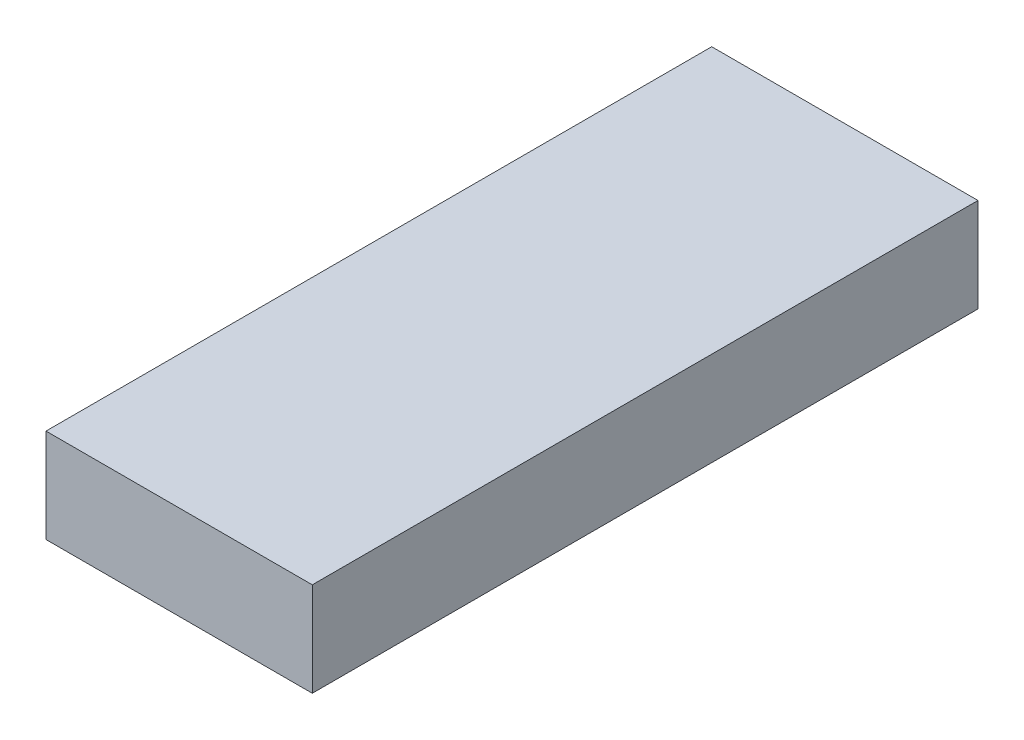
ISO-10303-21;
HEADER;
FILE_DESCRIPTION(('STEP AP214'),'2;1');
FILE_NAME('part.step','',(''),(''),'','','');
FILE_SCHEMA(('AUTOMOTIVE_DESIGN { 1 0 10303 214 1 1 1 1 }'));
ENDSEC;
DATA;
#1=APPLICATION_CONTEXT('core data for automotive mechanical design processes');
#2=APPLICATION_PROTOCOL_DEFINITION('international standard','automotive_design',2000,#1);
#3=PRODUCT_CONTEXT('',#1,'mechanical');
#4=PRODUCT('Part','Part','',(#3));
#5=PRODUCT_RELATED_PRODUCT_CATEGORY('part','',(#4));
#6=PRODUCT_DEFINITION_FORMATION('','',#4);
#7=PRODUCT_DEFINITION_CONTEXT('part definition',#1,'design');
#8=PRODUCT_DEFINITION('design','',#6,#7);
#9=PRODUCT_DEFINITION_SHAPE('','',#8);
#10=(LENGTH_UNIT() NAMED_UNIT(*) SI_UNIT(.MILLI.,.METRE.));
#11=(NAMED_UNIT(*) PLANE_ANGLE_UNIT() SI_UNIT($,.RADIAN.));
#12=(NAMED_UNIT(*) SI_UNIT($,.STERADIAN.) SOLID_ANGLE_UNIT());
#13=UNCERTAINTY_MEASURE_WITH_UNIT(LENGTH_MEASURE(1.E-05),#10,'distance_accuracy_value','');
#14=(GEOMETRIC_REPRESENTATION_CONTEXT(3) GLOBAL_UNCERTAINTY_ASSIGNED_CONTEXT((#13)) GLOBAL_UNIT_ASSIGNED_CONTEXT((#10,
#11,#12)) REPRESENTATION_CONTEXT('',''));
#15=CARTESIAN_POINT('',(0.,0.,0.));
#16=DIRECTION('',(0.,0.,1.));
#17=DIRECTION('',(1.,0.,0.));
#18=AXIS2_PLACEMENT_3D('',#15,#16,#17);
#19=CARTESIAN_POINT('',(-9.000000034,6.35,-22.499999958));
#20=DIRECTION('',(1.,0.,0.));
#21=DIRECTION('',(0.,0.,-1.));
#22=AXIS2_PLACEMENT_3D('',#19,#20,#21);
#23=PLANE('',#22);
#24=DIRECTION('',(0.,0.,1.));
#25=VECTOR('',#24,1.);
#26=CARTESIAN_POINT('',(-9.000000034,0.,-22.499999958));
#27=LINE('',#26,#25);
#28=CARTESIAN_POINT('',(-9.000000034,0.,-22.499999958));
#29=VERTEX_POINT('',#28);
#30=CARTESIAN_POINT('',(-9.000000034,0.,22.499999958));
#31=VERTEX_POINT('',#30);
#32=EDGE_CURVE('E98',#29,#31,#27,.T.);
#33=ORIENTED_EDGE('',*,*,#32,.T.);
#34=DIRECTION('',(0.,-1.,0.));
#35=VECTOR('',#34,1.);
#36=CARTESIAN_POINT('',(-9.000000034,6.35,22.499999958));
#37=LINE('',#36,#35);
#38=CARTESIAN_POINT('',(-9.000000034,6.35,22.499999958));
#39=VERTEX_POINT('',#38);
#40=EDGE_CURVE('E11',#39,#31,#37,.T.);
#41=ORIENTED_EDGE('',*,*,#40,.F.);
#42=DIRECTION('',(0.,0.,1.));
#43=VECTOR('',#42,1.);
#44=CARTESIAN_POINT('',(-9.000000034,6.35,-22.499999958));
#45=LINE('',#44,#43);
#46=CARTESIAN_POINT('',(-9.000000034,6.35,-22.499999958));
#47=VERTEX_POINT('',#46);
#48=EDGE_CURVE('E86',#47,#39,#45,.T.);
#49=ORIENTED_EDGE('',*,*,#48,.F.);
#50=DIRECTION('',(0.,-1.,0.));
#51=VECTOR('',#50,1.);
#52=CARTESIAN_POINT('',(-9.000000034,6.35,-22.499999958));
#53=LINE('',#52,#51);
#54=EDGE_CURVE('E94',#47,#29,#53,.T.);
#55=ORIENTED_EDGE('',*,*,#54,.T.);
#56=EDGE_LOOP('',(#33,#41,#49,#55));
#57=FACE_BOUND('',#56,.T.);
#58=ADVANCED_FACE('F35',(#57),#23,.F.);
#59=CARTESIAN_POINT('',(9.00000003400001,6.35,22.499999958));
#60=DIRECTION('',(0.,0.,-1.));
#61=DIRECTION('',(-1.,0.,0.));
#62=AXIS2_PLACEMENT_3D('',#59,#60,#61);
#63=PLANE('',#62);
#64=DIRECTION('',(1.,0.,0.));
#65=VECTOR('',#64,1.);
#66=CARTESIAN_POINT('',(9.00000003400001,0.,22.499999958));
#67=LINE('',#66,#65);
#68=CARTESIAN_POINT('',(9.00000003400001,0.,22.499999958));
#69=VERTEX_POINT('',#68);
#70=EDGE_CURVE('E90',#31,#69,#67,.T.);
#71=ORIENTED_EDGE('',*,*,#70,.T.);
#72=DIRECTION('',(0.,-1.,0.));
#73=VECTOR('',#72,1.);
#74=CARTESIAN_POINT('',(9.00000003400001,6.35,22.499999958));
#75=LINE('',#74,#73);
#76=CARTESIAN_POINT('',(9.00000003400001,6.35,22.499999958));
#77=VERTEX_POINT('',#76);
#78=EDGE_CURVE('E43',#77,#69,#75,.T.);
#79=ORIENTED_EDGE('',*,*,#78,.F.);
#80=DIRECTION('',(1.,0.,0.));
#81=VECTOR('',#80,1.);
#82=CARTESIAN_POINT('',(9.00000003400001,6.35,22.499999958));
#83=LINE('',#82,#81);
#84=EDGE_CURVE('E81',#39,#77,#83,.T.);
#85=ORIENTED_EDGE('',*,*,#84,.F.);
#86=ORIENTED_EDGE('',*,*,#40,.T.);
#87=EDGE_LOOP('',(#71,#79,#85,#86));
#88=FACE_BOUND('',#87,.T.);
#89=ADVANCED_FACE('F89',(#88),#63,.F.);
#90=CARTESIAN_POINT('',(9.000000034,6.35,-22.499999958));
#91=DIRECTION('',(-1.,0.,0.));
#92=DIRECTION('',(0.,0.,1.));
#93=AXIS2_PLACEMENT_3D('',#90,#91,#92);
#94=PLANE('',#93);
#95=DIRECTION('',(0.,0.,-1.));
#96=VECTOR('',#95,1.);
#97=CARTESIAN_POINT('',(9.000000034,0.,-22.499999958));
#98=LINE('',#97,#96);
#99=CARTESIAN_POINT('',(9.000000034,0.,-22.499999958));
#100=VERTEX_POINT('',#99);
#101=EDGE_CURVE('E68',#69,#100,#98,.T.);
#102=ORIENTED_EDGE('',*,*,#101,.T.);
#103=DIRECTION('',(0.,-1.,0.));
#104=VECTOR('',#103,1.);
#105=CARTESIAN_POINT('',(9.000000034,6.35,-22.499999958));
#106=LINE('',#105,#104);
#107=CARTESIAN_POINT('',(9.000000034,6.35,-22.499999958));
#108=VERTEX_POINT('',#107);
#109=EDGE_CURVE('E91',#108,#100,#106,.T.);
#110=ORIENTED_EDGE('',*,*,#109,.F.);
#111=DIRECTION('',(0.,0.,-1.));
#112=VECTOR('',#111,1.);
#113=CARTESIAN_POINT('',(9.000000034,6.35,-22.499999958));
#114=LINE('',#113,#112);
#115=EDGE_CURVE('E84',#77,#108,#114,.T.);
#116=ORIENTED_EDGE('',*,*,#115,.F.);
#117=ORIENTED_EDGE('',*,*,#78,.T.);
#118=EDGE_LOOP('',(#102,#110,#116,#117));
#119=FACE_BOUND('',#118,.T.);
#120=ADVANCED_FACE('F92',(#119),#94,.F.);
#121=CARTESIAN_POINT('',(9.000000034,6.35,-22.499999958));
#122=DIRECTION('',(0.,0.,1.));
#123=DIRECTION('',(1.,0.,0.));
#124=AXIS2_PLACEMENT_3D('',#121,#122,#123);
#125=PLANE('',#124);
#126=DIRECTION('',(-1.,0.,0.));
#127=VECTOR('',#126,1.);
#128=CARTESIAN_POINT('',(9.000000034,0.,-22.499999958));
#129=LINE('',#128,#127);
#130=EDGE_CURVE('E74',#100,#29,#129,.T.);
#131=ORIENTED_EDGE('',*,*,#130,.T.);
#132=ORIENTED_EDGE('',*,*,#54,.F.);
#133=DIRECTION('',(-1.,0.,0.));
#134=VECTOR('',#133,1.);
#135=CARTESIAN_POINT('',(9.000000034,6.35,-22.499999958));
#136=LINE('',#135,#134);
#137=EDGE_CURVE('E51',#108,#47,#136,.T.);
#138=ORIENTED_EDGE('',*,*,#137,.F.);
#139=ORIENTED_EDGE('',*,*,#109,.T.);
#140=EDGE_LOOP('',(#131,#132,#138,#139));
#141=FACE_BOUND('',#140,.T.);
#142=ADVANCED_FACE('F105',(#141),#125,.F.);
#143=CARTESIAN_POINT('',(0.,6.35,0.));
#144=DIRECTION('',(0.,-1.,0.));
#145=DIRECTION('',(0.,0.,-1.));
#146=AXIS2_PLACEMENT_3D('',#143,#144,#145);
#147=PLANE('',#146);
#148=ORIENTED_EDGE('',*,*,#48,.T.);
#149=ORIENTED_EDGE('',*,*,#84,.T.);
#150=ORIENTED_EDGE('',*,*,#115,.T.);
#151=ORIENTED_EDGE('',*,*,#137,.T.);
#152=EDGE_LOOP('',(#148,#149,#150,#151));
#153=FACE_BOUND('',#152,.T.);
#154=ADVANCED_FACE('F82',(#153),#147,.F.);
#155=CARTESIAN_POINT('',(0.,0.,0.));
#156=DIRECTION('',(0.,-1.,0.));
#157=DIRECTION('',(0.,0.,-1.));
#158=AXIS2_PLACEMENT_3D('',#155,#156,#157);
#159=PLANE('',#158);
#160=ORIENTED_EDGE('',*,*,#32,.F.);
#161=ORIENTED_EDGE('',*,*,#130,.F.);
#162=ORIENTED_EDGE('',*,*,#101,.F.);
#163=ORIENTED_EDGE('',*,*,#70,.F.);
#164=EDGE_LOOP('',(#160,#161,#162,#163));
#165=FACE_BOUND('',#164,.T.);
#166=ADVANCED_FACE('F108',(#165),#159,.T.);
#167=CLOSED_SHELL('',(#58,#89,#120,#142,#154,#166));
#168=MANIFOLD_SOLID_BREP('B2',#167);
#169=ADVANCED_BREP_SHAPE_REPRESENTATION('',(#18,#168),#14);
#170=SHAPE_DEFINITION_REPRESENTATION(#9,#169);
ENDSEC;
END-ISO-10303-21;
